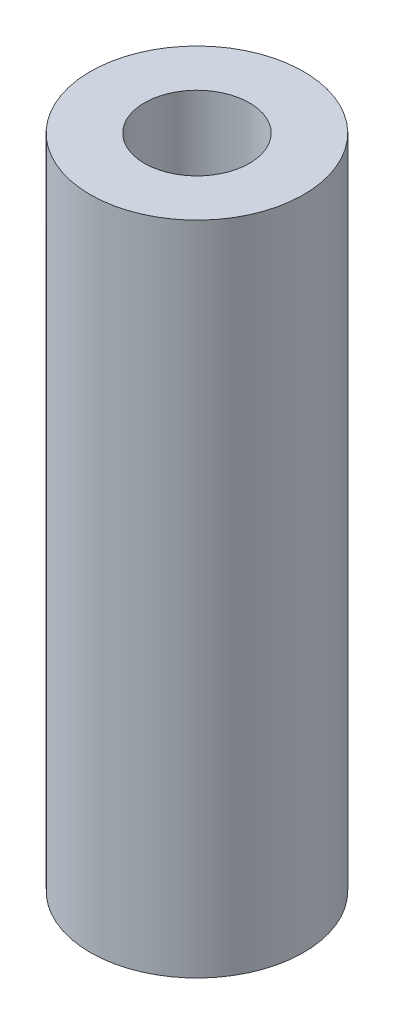
ISO-10303-21;
HEADER;
FILE_DESCRIPTION(('STEP AP214'),'2;1');
FILE_NAME('part.step','',(''),(''),'','','');
FILE_SCHEMA(('AUTOMOTIVE_DESIGN { 1 0 10303 214 1 1 1 1 }'));
ENDSEC;
DATA;
#1=APPLICATION_CONTEXT('core data for automotive mechanical design processes');
#2=APPLICATION_PROTOCOL_DEFINITION('international standard','automotive_design',2000,#1);
#3=PRODUCT_CONTEXT('',#1,'mechanical');
#4=PRODUCT('Part','Part','',(#3));
#5=PRODUCT_RELATED_PRODUCT_CATEGORY('part','',(#4));
#6=PRODUCT_DEFINITION_FORMATION('','',#4);
#7=PRODUCT_DEFINITION_CONTEXT('part definition',#1,'design');
#8=PRODUCT_DEFINITION('design','',#6,#7);
#9=PRODUCT_DEFINITION_SHAPE('','',#8);
#10=(LENGTH_UNIT() NAMED_UNIT(*) SI_UNIT(.MILLI.,.METRE.));
#11=(NAMED_UNIT(*) PLANE_ANGLE_UNIT() SI_UNIT($,.RADIAN.));
#12=(NAMED_UNIT(*) SI_UNIT($,.STERADIAN.) SOLID_ANGLE_UNIT());
#13=UNCERTAINTY_MEASURE_WITH_UNIT(LENGTH_MEASURE(1.E-05),#10,'distance_accuracy_value','');
#14=(GEOMETRIC_REPRESENTATION_CONTEXT(3) GLOBAL_UNCERTAINTY_ASSIGNED_CONTEXT((#13)) GLOBAL_UNIT_ASSIGNED_CONTEXT((#10,
#11,#12)) REPRESENTATION_CONTEXT('',''));
#15=CARTESIAN_POINT('',(0.,0.,0.));
#16=DIRECTION('',(0.,0.,1.));
#17=DIRECTION('',(1.,0.,0.));
#18=AXIS2_PLACEMENT_3D('',#15,#16,#17);
#19=CARTESIAN_POINT('',(0.,20.,0.));
#20=DIRECTION('',(0.,1.,0.));
#21=DIRECTION('',(0.,0.,1.));
#22=AXIS2_PLACEMENT_3D('',#19,#20,#21);
#23=PLANE('',#22);
#24=CARTESIAN_POINT('',(0.,20.,0.));
#25=DIRECTION('',(0.,1.,0.));
#26=DIRECTION('',(0.,0.,1.));
#27=AXIS2_PLACEMENT_3D('',#24,#25,#26);
#28=CIRCLE('',#27,3.25);
#29=CARTESIAN_POINT('',(0.,20.,3.25));
#30=VERTEX_POINT('',#29);
#31=EDGE_CURVE('E10',#30,#30,#28,.T.);
#32=ORIENTED_EDGE('',*,*,#31,.T.);
#33=EDGE_LOOP('',(#32));
#34=FACE_BOUND('',#33,.T.);
#35=CARTESIAN_POINT('',(0.,20.,0.));
#36=DIRECTION('',(0.,1.,0.));
#37=DIRECTION('',(0.,0.,1.));
#38=AXIS2_PLACEMENT_3D('',#35,#36,#37);
#39=CIRCLE('',#38,1.6);
#40=CARTESIAN_POINT('',(0.,20.,1.6));
#41=VERTEX_POINT('',#40);
#42=EDGE_CURVE('E43',#41,#41,#39,.T.);
#43=ORIENTED_EDGE('',*,*,#42,.F.);
#44=EDGE_LOOP('',(#43));
#45=FACE_BOUND('',#44,.T.);
#46=ADVANCED_FACE('F32',(#34,#45),#23,.T.);
#47=CARTESIAN_POINT('',(0.,0.,0.));
#48=DIRECTION('',(0.,1.,0.));
#49=DIRECTION('',(0.,0.,1.));
#50=AXIS2_PLACEMENT_3D('',#47,#48,#49);
#51=PLANE('',#50);
#52=CARTESIAN_POINT('',(0.,0.,0.));
#53=DIRECTION('',(0.,1.,0.));
#54=DIRECTION('',(0.,0.,1.));
#55=AXIS2_PLACEMENT_3D('',#52,#53,#54);
#56=CIRCLE('',#55,3.25);
#57=CARTESIAN_POINT('',(0.,0.,3.25));
#58=VERTEX_POINT('',#57);
#59=EDGE_CURVE('E36',#58,#58,#56,.T.);
#60=ORIENTED_EDGE('',*,*,#59,.F.);
#61=EDGE_LOOP('',(#60));
#62=FACE_BOUND('',#61,.T.);
#63=CARTESIAN_POINT('',(0.,0.,0.));
#64=DIRECTION('',(0.,1.,0.));
#65=DIRECTION('',(0.,0.,1.));
#66=AXIS2_PLACEMENT_3D('',#63,#64,#65);
#67=CIRCLE('',#66,1.6);
#68=CARTESIAN_POINT('',(0.,0.,1.6));
#69=VERTEX_POINT('',#68);
#70=EDGE_CURVE('E45',#69,#69,#67,.T.);
#71=ORIENTED_EDGE('',*,*,#70,.T.);
#72=EDGE_LOOP('',(#71));
#73=FACE_BOUND('',#72,.T.);
#74=ADVANCED_FACE('F55',(#62,#73),#51,.F.);
#75=CARTESIAN_POINT('',(0.,20.,0.));
#76=DIRECTION('',(0.,-1.,0.));
#77=DIRECTION('',(0.,0.,-1.));
#78=AXIS2_PLACEMENT_3D('',#75,#76,#77);
#79=CYLINDRICAL_SURFACE('',#78,3.25);
#80=ORIENTED_EDGE('',*,*,#31,.F.);
#81=EDGE_LOOP('',(#80));
#82=FACE_BOUND('',#81,.T.);
#83=ORIENTED_EDGE('',*,*,#59,.T.);
#84=EDGE_LOOP('',(#83));
#85=FACE_BOUND('',#84,.T.);
#86=ADVANCED_FACE('F34',(#82,#85),#79,.T.);
#87=CARTESIAN_POINT('',(0.,20.,0.));
#88=DIRECTION('',(0.,-1.,0.));
#89=DIRECTION('',(0.,0.,-1.));
#90=AXIS2_PLACEMENT_3D('',#87,#88,#89);
#91=CYLINDRICAL_SURFACE('',#90,1.6);
#92=ORIENTED_EDGE('',*,*,#42,.T.);
#93=EDGE_LOOP('',(#92));
#94=FACE_BOUND('',#93,.T.);
#95=ORIENTED_EDGE('',*,*,#70,.F.);
#96=EDGE_LOOP('',(#95));
#97=FACE_BOUND('',#96,.T.);
#98=ADVANCED_FACE('F51',(#94,#97),#91,.F.);
#99=CLOSED_SHELL('',(#46,#74,#86,#98));
#100=MANIFOLD_SOLID_BREP('B2',#99);
#101=ADVANCED_BREP_SHAPE_REPRESENTATION('',(#18,#100),#14);
#102=SHAPE_DEFINITION_REPRESENTATION(#9,#101);
ENDSEC;
END-ISO-10303-21;
